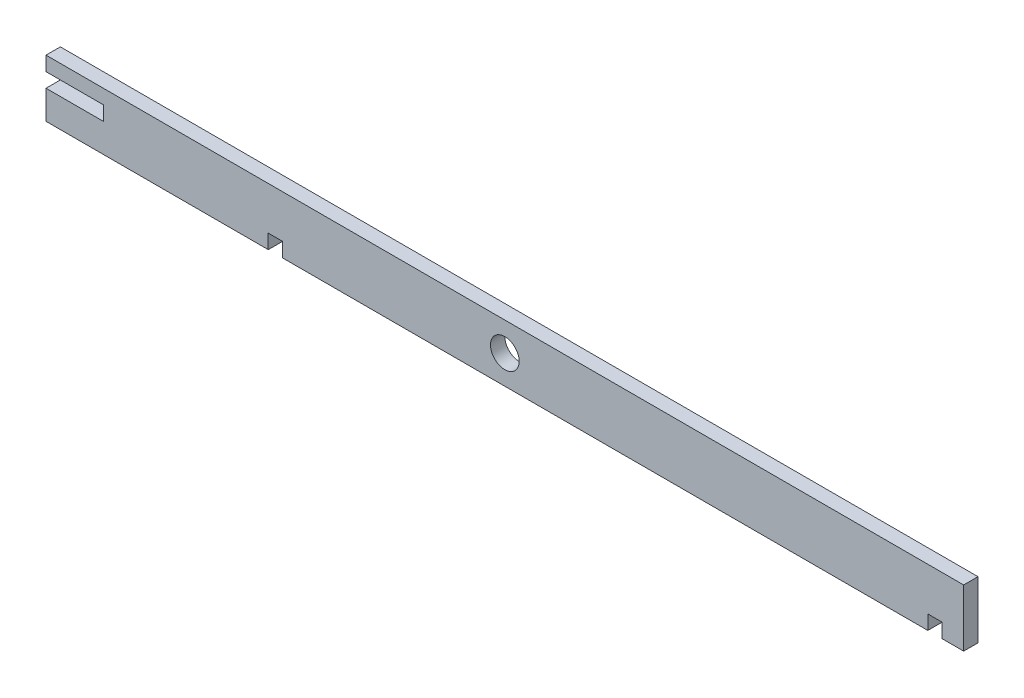
ISO-10303-21;
HEADER;
FILE_DESCRIPTION(('STEP AP214'),'2;1');
FILE_NAME('part.step','',(''),(''),'','','');
FILE_SCHEMA(('AUTOMOTIVE_DESIGN { 1 0 10303 214 1 1 1 1 }'));
ENDSEC;
DATA;
#1=APPLICATION_CONTEXT('core data for automotive mechanical design processes');
#2=APPLICATION_PROTOCOL_DEFINITION('international standard','automotive_design',2000,#1);
#3=PRODUCT_CONTEXT('',#1,'mechanical');
#4=PRODUCT('Part','Part','',(#3));
#5=PRODUCT_RELATED_PRODUCT_CATEGORY('part','',(#4));
#6=PRODUCT_DEFINITION_FORMATION('','',#4);
#7=PRODUCT_DEFINITION_CONTEXT('part definition',#1,'design');
#8=PRODUCT_DEFINITION('design','',#6,#7);
#9=PRODUCT_DEFINITION_SHAPE('','',#8);
#10=(LENGTH_UNIT() NAMED_UNIT(*) SI_UNIT(.MILLI.,.METRE.));
#11=(NAMED_UNIT(*) PLANE_ANGLE_UNIT() SI_UNIT($,.RADIAN.));
#12=(NAMED_UNIT(*) SI_UNIT($,.STERADIAN.) SOLID_ANGLE_UNIT());
#13=UNCERTAINTY_MEASURE_WITH_UNIT(LENGTH_MEASURE(1.E-05),#10,'distance_accuracy_value','');
#14=(GEOMETRIC_REPRESENTATION_CONTEXT(3) GLOBAL_UNCERTAINTY_ASSIGNED_CONTEXT((#13)) GLOBAL_UNIT_ASSIGNED_CONTEXT((#10,
#11,#12)) REPRESENTATION_CONTEXT('',''));
#15=CARTESIAN_POINT('',(0.,0.,0.));
#16=DIRECTION('',(0.,0.,1.));
#17=DIRECTION('',(1.,0.,0.));
#18=AXIS2_PLACEMENT_3D('',#15,#16,#17);
#19=CARTESIAN_POINT('',(-153.9875,0.,3.175));
#20=DIRECTION('',(1.,0.,0.));
#21=DIRECTION('',(0.,0.,-1.));
#22=AXIS2_PLACEMENT_3D('',#19,#20,#21);
#23=PLANE('',#22);
#24=DIRECTION('',(0.,-1.,0.));
#25=VECTOR('',#24,1.);
#26=CARTESIAN_POINT('',(-153.9875,0.,0.));
#27=LINE('',#26,#25);
#28=CARTESIAN_POINT('',(-153.9875,-9.52500000000001,0.));
#29=VERTEX_POINT('',#28);
#30=CARTESIAN_POINT('',(-153.9875,-12.7,0.));
#31=VERTEX_POINT('',#30);
#32=EDGE_CURVE('E197',#29,#31,#27,.T.);
#33=ORIENTED_EDGE('',*,*,#32,.F.);
#34=DIRECTION('',(0.,0.,-1.));
#35=VECTOR('',#34,1.);
#36=CARTESIAN_POINT('',(-153.9875,-9.52500000000001,3.175));
#37=LINE('',#36,#35);
#38=CARTESIAN_POINT('',(-153.9875,-9.52500000000001,3.175));
#39=VERTEX_POINT('',#38);
#40=EDGE_CURVE('E11',#39,#29,#37,.T.);
#41=ORIENTED_EDGE('',*,*,#40,.F.);
#42=DIRECTION('',(0.,-1.,0.));
#43=VECTOR('',#42,1.);
#44=CARTESIAN_POINT('',(-153.9875,0.,3.175));
#45=LINE('',#44,#43);
#46=CARTESIAN_POINT('',(-153.9875,-12.7,3.175));
#47=VERTEX_POINT('',#46);
#48=EDGE_CURVE('E361',#39,#47,#45,.T.);
#49=ORIENTED_EDGE('',*,*,#48,.T.);
#50=DIRECTION('',(0.,0.,-1.));
#51=VECTOR('',#50,1.);
#52=CARTESIAN_POINT('',(-153.9875,-12.7,3.175));
#53=LINE('',#52,#51);
#54=EDGE_CURVE('E118',#47,#31,#53,.T.);
#55=ORIENTED_EDGE('',*,*,#54,.T.);
#56=EDGE_LOOP('',(#33,#41,#49,#55));
#57=FACE_BOUND('',#56,.T.);
#58=ADVANCED_FACE('F41',(#57),#23,.T.);
#59=CARTESIAN_POINT('',(0.,-9.52500000000001,3.175));
#60=DIRECTION('',(0.,1.,0.));
#61=DIRECTION('',(0.,0.,1.));
#62=AXIS2_PLACEMENT_3D('',#59,#60,#61);
#63=PLANE('',#62);
#64=DIRECTION('',(1.,0.,0.));
#65=VECTOR('',#64,1.);
#66=CARTESIAN_POINT('',(0.,-9.52500000000001,0.));
#67=LINE('',#66,#65);
#68=CARTESIAN_POINT('',(-150.8125,-9.52500000000001,0.));
#69=VERTEX_POINT('',#68);
#70=EDGE_CURVE('E200',#29,#69,#67,.T.);
#71=ORIENTED_EDGE('',*,*,#70,.T.);
#72=DIRECTION('',(0.,0.,-1.));
#73=VECTOR('',#72,1.);
#74=CARTESIAN_POINT('',(-150.8125,-9.52500000000001,3.175));
#75=LINE('',#74,#73);
#76=CARTESIAN_POINT('',(-150.8125,-9.52500000000001,3.175));
#77=VERTEX_POINT('',#76);
#78=EDGE_CURVE('E51',#77,#69,#75,.T.);
#79=ORIENTED_EDGE('',*,*,#78,.F.);
#80=DIRECTION('',(1.,0.,0.));
#81=VECTOR('',#80,1.);
#82=CARTESIAN_POINT('',(0.,-9.52500000000001,3.175));
#83=LINE('',#82,#81);
#84=EDGE_CURVE('E365',#39,#77,#83,.T.);
#85=ORIENTED_EDGE('',*,*,#84,.F.);
#86=ORIENTED_EDGE('',*,*,#40,.T.);
#87=EDGE_LOOP('',(#71,#79,#85,#86));
#88=FACE_BOUND('',#87,.T.);
#89=ADVANCED_FACE('F300',(#88),#63,.F.);
#90=CARTESIAN_POINT('',(-150.8125,0.,3.175));
#91=DIRECTION('',(1.,0.,0.));
#92=DIRECTION('',(0.,0.,-1.));
#93=AXIS2_PLACEMENT_3D('',#90,#91,#92);
#94=PLANE('',#93);
#95=DIRECTION('',(0.,-1.,0.));
#96=VECTOR('',#95,1.);
#97=CARTESIAN_POINT('',(-150.8125,0.,0.));
#98=LINE('',#97,#96);
#99=CARTESIAN_POINT('',(-150.8125,-12.7,0.));
#100=VERTEX_POINT('',#99);
#101=EDGE_CURVE('E204',#69,#100,#98,.T.);
#102=ORIENTED_EDGE('',*,*,#101,.T.);
#103=DIRECTION('',(0.,0.,-1.));
#104=VECTOR('',#103,1.);
#105=CARTESIAN_POINT('',(-150.8125,-12.7,3.175));
#106=LINE('',#105,#104);
#107=CARTESIAN_POINT('',(-150.8125,-12.7,3.175));
#108=VERTEX_POINT('',#107);
#109=EDGE_CURVE('E286',#108,#100,#106,.T.);
#110=ORIENTED_EDGE('',*,*,#109,.F.);
#111=DIRECTION('',(0.,-1.,0.));
#112=VECTOR('',#111,1.);
#113=CARTESIAN_POINT('',(-150.8125,0.,3.175));
#114=LINE('',#113,#112);
#115=EDGE_CURVE('E296',#77,#108,#114,.T.);
#116=ORIENTED_EDGE('',*,*,#115,.F.);
#117=ORIENTED_EDGE('',*,*,#78,.T.);
#118=EDGE_LOOP('',(#102,#110,#116,#117));
#119=FACE_BOUND('',#118,.T.);
#120=ADVANCED_FACE('F293',(#119),#94,.F.);
#121=CARTESIAN_POINT('',(0.,-12.7,3.175));
#122=DIRECTION('',(0.,1.,0.));
#123=DIRECTION('',(-1.,0.,0.));
#124=AXIS2_PLACEMENT_3D('',#121,#122,#123);
#125=PLANE('',#124);
#126=DIRECTION('',(1.,0.,0.));
#127=VECTOR('',#126,1.);
#128=CARTESIAN_POINT('',(0.,-12.7,0.));
#129=LINE('',#128,#127);
#130=CARTESIAN_POINT('',(-7.9375,-12.7,0.));
#131=VERTEX_POINT('',#130);
#132=EDGE_CURVE('E208',#100,#131,#129,.T.);
#133=ORIENTED_EDGE('',*,*,#132,.T.);
#134=DIRECTION('',(0.,0.,-1.));
#135=VECTOR('',#134,1.);
#136=CARTESIAN_POINT('',(-7.9375,-12.7,3.175));
#137=LINE('',#136,#135);
#138=CARTESIAN_POINT('',(-7.9375,-12.7,3.175));
#139=VERTEX_POINT('',#138);
#140=EDGE_CURVE('E283',#139,#131,#137,.T.);
#141=ORIENTED_EDGE('',*,*,#140,.F.);
#142=DIRECTION('',(1.,0.,0.));
#143=VECTOR('',#142,1.);
#144=CARTESIAN_POINT('',(0.,-12.7,3.175));
#145=LINE('',#144,#143);
#146=EDGE_CURVE('E372',#108,#139,#145,.T.);
#147=ORIENTED_EDGE('',*,*,#146,.F.);
#148=ORIENTED_EDGE('',*,*,#109,.T.);
#149=EDGE_LOOP('',(#133,#141,#147,#148));
#150=FACE_BOUND('',#149,.T.);
#151=ADVANCED_FACE('F310',(#150),#125,.F.);
#152=CARTESIAN_POINT('',(-7.9375,0.,3.175));
#153=DIRECTION('',(1.,0.,0.));
#154=DIRECTION('',(0.,0.,-1.));
#155=AXIS2_PLACEMENT_3D('',#152,#153,#154);
#156=PLANE('',#155);
#157=DIRECTION('',(0.,-1.,0.));
#158=VECTOR('',#157,1.);
#159=CARTESIAN_POINT('',(-7.9375,0.,0.));
#160=LINE('',#159,#158);
#161=CARTESIAN_POINT('',(-7.9375,-9.52500000000001,0.));
#162=VERTEX_POINT('',#161);
#163=EDGE_CURVE('E212',#162,#131,#160,.T.);
#164=ORIENTED_EDGE('',*,*,#163,.F.);
#165=DIRECTION('',(0.,0.,-1.));
#166=VECTOR('',#165,1.);
#167=CARTESIAN_POINT('',(-7.9375,-9.52500000000001,3.175));
#168=LINE('',#167,#166);
#169=CARTESIAN_POINT('',(-7.9375,-9.52500000000001,3.175));
#170=VERTEX_POINT('',#169);
#171=EDGE_CURVE('E280',#170,#162,#168,.T.);
#172=ORIENTED_EDGE('',*,*,#171,.F.);
#173=DIRECTION('',(0.,-1.,0.));
#174=VECTOR('',#173,1.);
#175=CARTESIAN_POINT('',(-7.9375,0.,3.175));
#176=LINE('',#175,#174);
#177=EDGE_CURVE('E375',#170,#139,#176,.T.);
#178=ORIENTED_EDGE('',*,*,#177,.T.);
#179=ORIENTED_EDGE('',*,*,#140,.T.);
#180=EDGE_LOOP('',(#164,#172,#178,#179));
#181=FACE_BOUND('',#180,.T.);
#182=ADVANCED_FACE('F311',(#181),#156,.T.);
#183=CARTESIAN_POINT('',(0.,-9.52500000000001,3.175));
#184=DIRECTION('',(0.,1.,0.));
#185=DIRECTION('',(0.,0.,1.));
#186=AXIS2_PLACEMENT_3D('',#183,#184,#185);
#187=PLANE('',#186);
#188=DIRECTION('',(1.,0.,0.));
#189=VECTOR('',#188,1.);
#190=CARTESIAN_POINT('',(0.,-9.52500000000001,0.));
#191=LINE('',#190,#189);
#192=CARTESIAN_POINT('',(-4.7625,-9.52500000000001,0.));
#193=VERTEX_POINT('',#192);
#194=EDGE_CURVE('E217',#162,#193,#191,.T.);
#195=ORIENTED_EDGE('',*,*,#194,.T.);
#196=DIRECTION('',(0.,0.,-1.));
#197=VECTOR('',#196,1.);
#198=CARTESIAN_POINT('',(-4.7625,-9.52500000000001,3.175));
#199=LINE('',#198,#197);
#200=CARTESIAN_POINT('',(-4.7625,-9.52500000000001,3.175));
#201=VERTEX_POINT('',#200);
#202=EDGE_CURVE('E276',#201,#193,#199,.T.);
#203=ORIENTED_EDGE('',*,*,#202,.F.);
#204=DIRECTION('',(1.,0.,0.));
#205=VECTOR('',#204,1.);
#206=CARTESIAN_POINT('',(0.,-9.52500000000001,3.175));
#207=LINE('',#206,#205);
#208=EDGE_CURVE('E380',#170,#201,#207,.T.);
#209=ORIENTED_EDGE('',*,*,#208,.F.);
#210=ORIENTED_EDGE('',*,*,#171,.T.);
#211=EDGE_LOOP('',(#195,#203,#209,#210));
#212=FACE_BOUND('',#211,.T.);
#213=ADVANCED_FACE('F314',(#212),#187,.F.);
#214=CARTESIAN_POINT('',(-4.76249999999999,0.,3.175));
#215=DIRECTION('',(1.,0.,0.));
#216=DIRECTION('',(0.,1.,0.));
#217=AXIS2_PLACEMENT_3D('',#214,#215,#216);
#218=PLANE('',#217);
#219=DIRECTION('',(0.,-1.,0.));
#220=VECTOR('',#219,1.);
#221=CARTESIAN_POINT('',(-4.76249999999999,0.,0.));
#222=LINE('',#221,#220);
#223=CARTESIAN_POINT('',(-4.7625,-12.7,0.));
#224=VERTEX_POINT('',#223);
#225=EDGE_CURVE('E221',#193,#224,#222,.T.);
#226=ORIENTED_EDGE('',*,*,#225,.T.);
#227=DIRECTION('',(0.,0.,-1.));
#228=VECTOR('',#227,1.);
#229=CARTESIAN_POINT('',(-4.7625,-12.7,3.175));
#230=LINE('',#229,#228);
#231=CARTESIAN_POINT('',(-4.7625,-12.7,3.175));
#232=VERTEX_POINT('',#231);
#233=EDGE_CURVE('E272',#232,#224,#230,.T.);
#234=ORIENTED_EDGE('',*,*,#233,.F.);
#235=DIRECTION('',(0.,-1.,0.));
#236=VECTOR('',#235,1.);
#237=CARTESIAN_POINT('',(-4.76249999999999,0.,3.175));
#238=LINE('',#237,#236);
#239=EDGE_CURVE('E384',#201,#232,#238,.T.);
#240=ORIENTED_EDGE('',*,*,#239,.F.);
#241=ORIENTED_EDGE('',*,*,#202,.T.);
#242=EDGE_LOOP('',(#226,#234,#240,#241));
#243=FACE_BOUND('',#242,.T.);
#244=ADVANCED_FACE('F318',(#243),#218,.F.);
#245=CARTESIAN_POINT('',(0.,-12.7,0.));
#246=VERTEX_POINT('',#245);
#247=EDGE_CURVE('E213',#224,#246,#129,.T.);
#248=ORIENTED_EDGE('',*,*,#247,.T.);
#249=DIRECTION('',(0.,0.,-1.));
#250=VECTOR('',#249,1.);
#251=CARTESIAN_POINT('',(0.,-12.7,3.175));
#252=LINE('',#251,#250);
#253=CARTESIAN_POINT('',(0.,-12.7,3.175));
#254=VERTEX_POINT('',#253);
#255=EDGE_CURVE('E268',#254,#246,#252,.T.);
#256=ORIENTED_EDGE('',*,*,#255,.F.);
#257=EDGE_CURVE('E376',#232,#254,#145,.T.);
#258=ORIENTED_EDGE('',*,*,#257,.F.);
#259=ORIENTED_EDGE('',*,*,#233,.T.);
#260=EDGE_LOOP('',(#248,#256,#258,#259));
#261=FACE_BOUND('',#260,.T.);
#262=ADVANCED_FACE('F322',(#261),#125,.F.);
#263=CARTESIAN_POINT('',(0.,0.,3.175));
#264=DIRECTION('',(-1.,0.,0.));
#265=DIRECTION('',(0.,0.,1.));
#266=AXIS2_PLACEMENT_3D('',#263,#264,#265);
#267=PLANE('',#266);
#268=DIRECTION('',(0.,1.,0.));
#269=VECTOR('',#268,1.);
#270=CARTESIAN_POINT('',(0.,0.,0.));
#271=LINE('',#270,#269);
#272=CARTESIAN_POINT('',(0.,0.,0.));
#273=VERTEX_POINT('',#272);
#274=EDGE_CURVE('E225',#246,#273,#271,.T.);
#275=ORIENTED_EDGE('',*,*,#274,.T.);
#276=DIRECTION('',(0.,0.,-1.));
#277=VECTOR('',#276,1.);
#278=CARTESIAN_POINT('',(0.,0.,3.175));
#279=LINE('',#278,#277);
#280=CARTESIAN_POINT('',(0.,0.,3.175));
#281=VERTEX_POINT('',#280);
#282=EDGE_CURVE('E264',#281,#273,#279,.T.);
#283=ORIENTED_EDGE('',*,*,#282,.F.);
#284=DIRECTION('',(0.,1.,0.));
#285=VECTOR('',#284,1.);
#286=CARTESIAN_POINT('',(0.,0.,3.175));
#287=LINE('',#286,#285);
#288=EDGE_CURVE('E388',#254,#281,#287,.T.);
#289=ORIENTED_EDGE('',*,*,#288,.F.);
#290=ORIENTED_EDGE('',*,*,#255,.T.);
#291=EDGE_LOOP('',(#275,#283,#289,#290));
#292=FACE_BOUND('',#291,.T.);
#293=ADVANCED_FACE('F324',(#292),#267,.F.);
#294=CARTESIAN_POINT('',(0.,0.,3.175));
#295=DIRECTION('',(0.,-1.,0.));
#296=DIRECTION('',(1.,0.,0.));
#297=AXIS2_PLACEMENT_3D('',#294,#295,#296);
#298=PLANE('',#297);
#299=DIRECTION('',(-1.,0.,0.));
#300=VECTOR('',#299,1.);
#301=CARTESIAN_POINT('',(0.,0.,0.));
#302=LINE('',#301,#300);
#303=CARTESIAN_POINT('',(-203.2,0.,0.));
#304=VERTEX_POINT('',#303);
#305=EDGE_CURVE('E229',#273,#304,#302,.T.);
#306=ORIENTED_EDGE('',*,*,#305,.T.);
#307=DIRECTION('',(0.,0.,-1.));
#308=VECTOR('',#307,1.);
#309=CARTESIAN_POINT('',(-203.2,0.,3.175));
#310=LINE('',#309,#308);
#311=CARTESIAN_POINT('',(-203.2,0.,3.175));
#312=VERTEX_POINT('',#311);
#313=EDGE_CURVE('E260',#312,#304,#310,.T.);
#314=ORIENTED_EDGE('',*,*,#313,.F.);
#315=DIRECTION('',(-1.,0.,0.));
#316=VECTOR('',#315,1.);
#317=CARTESIAN_POINT('',(0.,0.,3.175));
#318=LINE('',#317,#316);
#319=EDGE_CURVE('E392',#281,#312,#318,.T.);
#320=ORIENTED_EDGE('',*,*,#319,.F.);
#321=ORIENTED_EDGE('',*,*,#282,.T.);
#322=EDGE_LOOP('',(#306,#314,#320,#321));
#323=FACE_BOUND('',#322,.T.);
#324=ADVANCED_FACE('F327',(#323),#298,.F.);
#325=CARTESIAN_POINT('',(-203.2,0.,3.175));
#326=DIRECTION('',(1.,0.,0.));
#327=DIRECTION('',(0.,0.,-1.));
#328=AXIS2_PLACEMENT_3D('',#325,#326,#327);
#329=PLANE('',#328);
#330=DIRECTION('',(0.,-1.,0.));
#331=VECTOR('',#330,1.);
#332=CARTESIAN_POINT('',(-203.2,0.,0.));
#333=LINE('',#332,#331);
#334=CARTESIAN_POINT('',(-203.2,-3.17500000000001,0.));
#335=VERTEX_POINT('',#334);
#336=EDGE_CURVE('E233',#304,#335,#333,.T.);
#337=ORIENTED_EDGE('',*,*,#336,.T.);
#338=DIRECTION('',(0.,0.,-1.));
#339=VECTOR('',#338,1.);
#340=CARTESIAN_POINT('',(-203.2,-3.17500000000001,3.175));
#341=LINE('',#340,#339);
#342=CARTESIAN_POINT('',(-203.2,-3.17500000000001,3.175));
#343=VERTEX_POINT('',#342);
#344=EDGE_CURVE('E257',#343,#335,#341,.T.);
#345=ORIENTED_EDGE('',*,*,#344,.F.);
#346=DIRECTION('',(0.,-1.,0.));
#347=VECTOR('',#346,1.);
#348=CARTESIAN_POINT('',(-203.2,0.,3.175));
#349=LINE('',#348,#347);
#350=EDGE_CURVE('E180',#312,#343,#349,.T.);
#351=ORIENTED_EDGE('',*,*,#350,.F.);
#352=ORIENTED_EDGE('',*,*,#313,.T.);
#353=EDGE_LOOP('',(#337,#345,#351,#352));
#354=FACE_BOUND('',#353,.T.);
#355=ADVANCED_FACE('F331',(#354),#329,.F.);
#356=CARTESIAN_POINT('',(0.,-3.17499999999998,3.175));
#357=DIRECTION('',(0.,-1.,0.));
#358=DIRECTION('',(1.,0.,0.));
#359=AXIS2_PLACEMENT_3D('',#356,#357,#358);
#360=PLANE('',#359);
#361=DIRECTION('',(-1.,0.,0.));
#362=VECTOR('',#361,1.);
#363=CARTESIAN_POINT('',(0.,-3.17499999999998,0.));
#364=LINE('',#363,#362);
#365=CARTESIAN_POINT('',(-190.5,-3.17500000000001,0.));
#366=VERTEX_POINT('',#365);
#367=EDGE_CURVE('E237',#366,#335,#364,.T.);
#368=ORIENTED_EDGE('',*,*,#367,.F.);
#369=DIRECTION('',(0.,0.,-1.));
#370=VECTOR('',#369,1.);
#371=CARTESIAN_POINT('',(-190.5,-3.17500000000001,3.175));
#372=LINE('',#371,#370);
#373=CARTESIAN_POINT('',(-190.5,-3.17500000000001,3.175));
#374=VERTEX_POINT('',#373);
#375=EDGE_CURVE('E254',#374,#366,#372,.T.);
#376=ORIENTED_EDGE('',*,*,#375,.F.);
#377=DIRECTION('',(-1.,0.,0.));
#378=VECTOR('',#377,1.);
#379=CARTESIAN_POINT('',(0.,-3.17499999999998,3.175));
#380=LINE('',#379,#378);
#381=EDGE_CURVE('E189',#374,#343,#380,.T.);
#382=ORIENTED_EDGE('',*,*,#381,.T.);
#383=ORIENTED_EDGE('',*,*,#344,.T.);
#384=EDGE_LOOP('',(#368,#376,#382,#383));
#385=FACE_BOUND('',#384,.T.);
#386=ADVANCED_FACE('F333',(#385),#360,.T.);
#387=CARTESIAN_POINT('',(-190.5,0.,3.175));
#388=DIRECTION('',(-1.,0.,0.));
#389=DIRECTION('',(0.,0.,1.));
#390=AXIS2_PLACEMENT_3D('',#387,#388,#389);
#391=PLANE('',#390);
#392=DIRECTION('',(0.,1.,0.));
#393=VECTOR('',#392,1.);
#394=CARTESIAN_POINT('',(-190.5,0.,0.));
#395=LINE('',#394,#393);
#396=CARTESIAN_POINT('',(-190.5,-6.35,0.));
#397=VERTEX_POINT('',#396);
#398=EDGE_CURVE('E242',#397,#366,#395,.T.);
#399=ORIENTED_EDGE('',*,*,#398,.F.);
#400=DIRECTION('',(0.,0.,-1.));
#401=VECTOR('',#400,1.);
#402=CARTESIAN_POINT('',(-190.5,-6.35,3.175));
#403=LINE('',#402,#401);
#404=CARTESIAN_POINT('',(-190.5,-6.35,3.175));
#405=VERTEX_POINT('',#404);
#406=EDGE_CURVE('E172',#405,#397,#403,.T.);
#407=ORIENTED_EDGE('',*,*,#406,.F.);
#408=DIRECTION('',(0.,1.,0.));
#409=VECTOR('',#408,1.);
#410=CARTESIAN_POINT('',(-190.5,0.,3.175));
#411=LINE('',#410,#409);
#412=EDGE_CURVE('E185',#405,#374,#411,.T.);
#413=ORIENTED_EDGE('',*,*,#412,.T.);
#414=ORIENTED_EDGE('',*,*,#375,.T.);
#415=EDGE_LOOP('',(#399,#407,#413,#414));
#416=FACE_BOUND('',#415,.T.);
#417=ADVANCED_FACE('F336',(#416),#391,.T.);
#418=CARTESIAN_POINT('',(0.,-6.34999999999999,3.175));
#419=DIRECTION('',(0.,1.,0.));
#420=DIRECTION('',(-1.,0.,0.));
#421=AXIS2_PLACEMENT_3D('',#418,#419,#420);
#422=PLANE('',#421);
#423=DIRECTION('',(1.,0.,0.));
#424=VECTOR('',#423,1.);
#425=CARTESIAN_POINT('',(0.,-6.34999999999999,0.));
#426=LINE('',#425,#424);
#427=CARTESIAN_POINT('',(-203.2,-6.35,0.));
#428=VERTEX_POINT('',#427);
#429=EDGE_CURVE('E168',#428,#397,#426,.T.);
#430=ORIENTED_EDGE('',*,*,#429,.F.);
#431=DIRECTION('',(0.,0.,-1.));
#432=VECTOR('',#431,1.);
#433=CARTESIAN_POINT('',(-203.2,-6.35,3.175));
#434=LINE('',#433,#432);
#435=CARTESIAN_POINT('',(-203.2,-6.35,3.175));
#436=VERTEX_POINT('',#435);
#437=EDGE_CURVE('E162',#436,#428,#434,.T.);
#438=ORIENTED_EDGE('',*,*,#437,.F.);
#439=DIRECTION('',(1.,0.,0.));
#440=VECTOR('',#439,1.);
#441=CARTESIAN_POINT('',(0.,-6.34999999999999,3.175));
#442=LINE('',#441,#440);
#443=EDGE_CURVE('E166',#436,#405,#442,.T.);
#444=ORIENTED_EDGE('',*,*,#443,.T.);
#445=ORIENTED_EDGE('',*,*,#406,.T.);
#446=EDGE_LOOP('',(#430,#438,#444,#445));
#447=FACE_BOUND('',#446,.T.);
#448=ADVANCED_FACE('F164',(#447),#422,.T.);
#449=CARTESIAN_POINT('',(-203.2,-12.7,0.));
#450=VERTEX_POINT('',#449);
#451=EDGE_CURVE('E238',#428,#450,#333,.T.);
#452=ORIENTED_EDGE('',*,*,#451,.T.);
#453=DIRECTION('',(0.,0.,-1.));
#454=VECTOR('',#453,1.);
#455=CARTESIAN_POINT('',(-203.2,-12.7,3.175));
#456=LINE('',#455,#454);
#457=CARTESIAN_POINT('',(-203.2,-12.7,3.175));
#458=VERTEX_POINT('',#457);
#459=EDGE_CURVE('E173',#458,#450,#456,.T.);
#460=ORIENTED_EDGE('',*,*,#459,.F.);
#461=EDGE_CURVE('E176',#436,#458,#349,.T.);
#462=ORIENTED_EDGE('',*,*,#461,.F.);
#463=ORIENTED_EDGE('',*,*,#437,.T.);
#464=EDGE_LOOP('',(#452,#460,#462,#463));
#465=FACE_BOUND('',#464,.T.);
#466=ADVANCED_FACE('F177',(#465),#329,.F.);
#467=CARTESIAN_POINT('',(-101.6,-6.35000000000001,3.175));
#468=DIRECTION('',(0.,0.,-1.));
#469=DIRECTION('',(-1.,0.,0.));
#470=AXIS2_PLACEMENT_3D('',#467,#468,#469);
#471=CYLINDRICAL_SURFACE('',#470,3.17500000000001);
#472=CARTESIAN_POINT('',(-101.6,-6.35000000000001,3.175));
#473=DIRECTION('',(0.,0.,1.));
#474=DIRECTION('',(1.,0.,0.));
#475=AXIS2_PLACEMENT_3D('',#472,#473,#474);
#476=CIRCLE('',#475,3.17500000000001);
#477=CARTESIAN_POINT('',(-98.425,-6.35000000000001,3.175));
#478=VERTEX_POINT('',#477);
#479=EDGE_CURVE('E358',#478,#478,#476,.T.);
#480=ORIENTED_EDGE('',*,*,#479,.T.);
#481=EDGE_LOOP('',(#480));
#482=FACE_BOUND('',#481,.T.);
#483=CARTESIAN_POINT('',(-101.6,-6.35000000000001,0.));
#484=DIRECTION('',(0.,0.,1.));
#485=DIRECTION('',(1.,0.,0.));
#486=AXIS2_PLACEMENT_3D('',#483,#484,#485);
#487=CIRCLE('',#486,3.17500000000001);
#488=CARTESIAN_POINT('',(-98.425,-6.35000000000001,0.));
#489=VERTEX_POINT('',#488);
#490=EDGE_CURVE('E193',#489,#489,#487,.T.);
#491=ORIENTED_EDGE('',*,*,#490,.F.);
#492=EDGE_LOOP('',(#491));
#493=FACE_BOUND('',#492,.T.);
#494=ADVANCED_FACE('F43',(#482,#493),#471,.F.);
#495=EDGE_CURVE('E111',#450,#31,#129,.T.);
#496=ORIENTED_EDGE('',*,*,#495,.T.);
#497=ORIENTED_EDGE('',*,*,#54,.F.);
#498=EDGE_CURVE('E59',#458,#47,#145,.T.);
#499=ORIENTED_EDGE('',*,*,#498,.F.);
#500=ORIENTED_EDGE('',*,*,#459,.T.);
#501=EDGE_LOOP('',(#496,#497,#499,#500));
#502=FACE_BOUND('',#501,.T.);
#503=ADVANCED_FACE('F345',(#502),#125,.F.);
#504=CARTESIAN_POINT('',(0.,0.,3.175));
#505=DIRECTION('',(0.,0.,1.));
#506=DIRECTION('',(1.,0.,0.));
#507=AXIS2_PLACEMENT_3D('',#504,#505,#506);
#508=PLANE('',#507);
#509=ORIENTED_EDGE('',*,*,#479,.F.);
#510=EDGE_LOOP('',(#509));
#511=FACE_BOUND('',#510,.T.);
#512=ORIENTED_EDGE('',*,*,#48,.F.);
#513=ORIENTED_EDGE('',*,*,#84,.T.);
#514=ORIENTED_EDGE('',*,*,#115,.T.);
#515=ORIENTED_EDGE('',*,*,#146,.T.);
#516=ORIENTED_EDGE('',*,*,#177,.F.);
#517=ORIENTED_EDGE('',*,*,#208,.T.);
#518=ORIENTED_EDGE('',*,*,#239,.T.);
#519=ORIENTED_EDGE('',*,*,#257,.T.);
#520=ORIENTED_EDGE('',*,*,#288,.T.);
#521=ORIENTED_EDGE('',*,*,#319,.T.);
#522=ORIENTED_EDGE('',*,*,#350,.T.);
#523=ORIENTED_EDGE('',*,*,#381,.F.);
#524=ORIENTED_EDGE('',*,*,#412,.F.);
#525=ORIENTED_EDGE('',*,*,#443,.F.);
#526=ORIENTED_EDGE('',*,*,#461,.T.);
#527=ORIENTED_EDGE('',*,*,#498,.T.);
#528=EDGE_LOOP('',(#512,#513,#514,#515,#516,#517,#518,#519,#520,#521,#522,#523,#524,#525,#526,#527));
#529=FACE_BOUND('',#528,.T.);
#530=ADVANCED_FACE('F182',(#511,#529),#508,.T.);
#531=CARTESIAN_POINT('',(0.,0.,0.));
#532=DIRECTION('',(0.,0.,1.));
#533=DIRECTION('',(1.,0.,0.));
#534=AXIS2_PLACEMENT_3D('',#531,#532,#533);
#535=PLANE('',#534);
#536=ORIENTED_EDGE('',*,*,#490,.T.);
#537=EDGE_LOOP('',(#536));
#538=FACE_BOUND('',#537,.T.);
#539=ORIENTED_EDGE('',*,*,#32,.T.);
#540=ORIENTED_EDGE('',*,*,#495,.F.);
#541=ORIENTED_EDGE('',*,*,#451,.F.);
#542=ORIENTED_EDGE('',*,*,#429,.T.);
#543=ORIENTED_EDGE('',*,*,#398,.T.);
#544=ORIENTED_EDGE('',*,*,#367,.T.);
#545=ORIENTED_EDGE('',*,*,#336,.F.);
#546=ORIENTED_EDGE('',*,*,#305,.F.);
#547=ORIENTED_EDGE('',*,*,#274,.F.);
#548=ORIENTED_EDGE('',*,*,#247,.F.);
#549=ORIENTED_EDGE('',*,*,#225,.F.);
#550=ORIENTED_EDGE('',*,*,#194,.F.);
#551=ORIENTED_EDGE('',*,*,#163,.T.);
#552=ORIENTED_EDGE('',*,*,#132,.F.);
#553=ORIENTED_EDGE('',*,*,#101,.F.);
#554=ORIENTED_EDGE('',*,*,#70,.F.);
#555=EDGE_LOOP('',(#539,#540,#541,#542,#543,#544,#545,#546,#547,#548,#549,#550,#551,#552,#553,#554));
#556=FACE_BOUND('',#555,.T.);
#557=ADVANCED_FACE('F301',(#538,#556),#535,.F.);
#558=CLOSED_SHELL('',(#58,#89,#120,#151,#182,#213,#244,#262,#293,#324,#355,#386,#417,#448,#466,
#494,#503,#530,#557));
#559=MANIFOLD_SOLID_BREP('B2',#558);
#560=ADVANCED_BREP_SHAPE_REPRESENTATION('',(#18,#559),#14);
#561=SHAPE_DEFINITION_REPRESENTATION(#9,#560);
ENDSEC;
END-ISO-10303-21;
